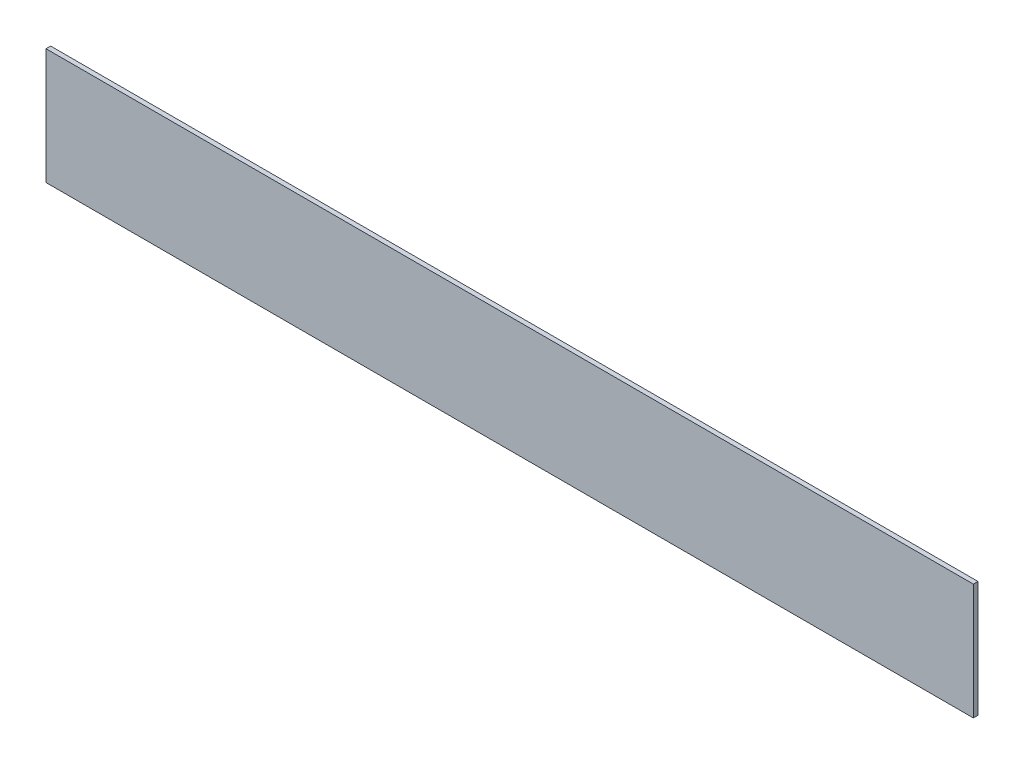
ISO-10303-21;
HEADER;
FILE_DESCRIPTION(('STEP AP214'),'2;1');
FILE_NAME('part.step','',(''),(''),'','','');
FILE_SCHEMA(('AUTOMOTIVE_DESIGN { 1 0 10303 214 1 1 1 1 }'));
ENDSEC;
DATA;
#1=APPLICATION_CONTEXT('core data for automotive mechanical design processes');
#2=APPLICATION_PROTOCOL_DEFINITION('international standard','automotive_design',2000,#1);
#3=PRODUCT_CONTEXT('',#1,'mechanical');
#4=PRODUCT('Part','Part','',(#3));
#5=PRODUCT_RELATED_PRODUCT_CATEGORY('part','',(#4));
#6=PRODUCT_DEFINITION_FORMATION('','',#4);
#7=PRODUCT_DEFINITION_CONTEXT('part definition',#1,'design');
#8=PRODUCT_DEFINITION('design','',#6,#7);
#9=PRODUCT_DEFINITION_SHAPE('','',#8);
#10=(LENGTH_UNIT() NAMED_UNIT(*) SI_UNIT(.MILLI.,.METRE.));
#11=(NAMED_UNIT(*) PLANE_ANGLE_UNIT() SI_UNIT($,.RADIAN.));
#12=(NAMED_UNIT(*) SI_UNIT($,.STERADIAN.) SOLID_ANGLE_UNIT());
#13=UNCERTAINTY_MEASURE_WITH_UNIT(LENGTH_MEASURE(1.E-05),#10,'distance_accuracy_value','');
#14=(GEOMETRIC_REPRESENTATION_CONTEXT(3) GLOBAL_UNCERTAINTY_ASSIGNED_CONTEXT((#13)) GLOBAL_UNIT_ASSIGNED_CONTEXT((#10,
#11,#12)) REPRESENTATION_CONTEXT('',''));
#15=CARTESIAN_POINT('',(0.,0.,0.));
#16=DIRECTION('',(0.,0.,1.));
#17=DIRECTION('',(1.,0.,0.));
#18=AXIS2_PLACEMENT_3D('',#15,#16,#17);
#19=CARTESIAN_POINT('',(0.,1.6,-320.));
#20=DIRECTION('',(-1.,0.,0.));
#21=DIRECTION('',(0.,0.,1.));
#22=AXIS2_PLACEMENT_3D('',#19,#20,#21);
#23=PLANE('',#22);
#24=DIRECTION('',(0.,-1.,0.));
#25=VECTOR('',#24,1.);
#26=CARTESIAN_POINT('',(0.,1.6,-318.4));
#27=LINE('',#26,#25);
#28=CARTESIAN_POINT('',(0.,41.6,-318.4));
#29=VERTEX_POINT('',#28);
#30=CARTESIAN_POINT('',(0.,1.6,-318.4));
#31=VERTEX_POINT('',#30);
#32=EDGE_CURVE('E103',#29,#31,#27,.T.);
#33=ORIENTED_EDGE('',*,*,#32,.F.);
#34=DIRECTION('',(0.,0.,1.));
#35=VECTOR('',#34,1.);
#36=CARTESIAN_POINT('',(0.,41.6,-320.));
#37=LINE('',#36,#35);
#38=CARTESIAN_POINT('',(0.,41.6,-320.));
#39=VERTEX_POINT('',#38);
#40=EDGE_CURVE('E11',#39,#29,#37,.T.);
#41=ORIENTED_EDGE('',*,*,#40,.F.);
#42=DIRECTION('',(0.,-1.,0.));
#43=VECTOR('',#42,1.);
#44=CARTESIAN_POINT('',(0.,1.6,-320.));
#45=LINE('',#44,#43);
#46=CARTESIAN_POINT('',(0.,1.6,-320.));
#47=VERTEX_POINT('',#46);
#48=EDGE_CURVE('E97',#39,#47,#45,.T.);
#49=ORIENTED_EDGE('',*,*,#48,.T.);
#50=DIRECTION('',(0.,0.,1.));
#51=VECTOR('',#50,1.);
#52=CARTESIAN_POINT('',(0.,1.6,-320.));
#53=LINE('',#52,#51);
#54=EDGE_CURVE('E42',#47,#31,#53,.T.);
#55=ORIENTED_EDGE('',*,*,#54,.T.);
#56=EDGE_LOOP('',(#33,#41,#49,#55));
#57=FACE_BOUND('',#56,.T.);
#58=ADVANCED_FACE('F39',(#57),#23,.T.);
#59=CARTESIAN_POINT('',(0.,41.6,-320.));
#60=DIRECTION('',(0.,1.,0.));
#61=DIRECTION('',(0.,0.,1.));
#62=AXIS2_PLACEMENT_3D('',#59,#60,#61);
#63=PLANE('',#62);
#64=DIRECTION('',(-1.,0.,0.));
#65=VECTOR('',#64,1.);
#66=CARTESIAN_POINT('',(0.,41.6,-318.4));
#67=LINE('',#66,#65);
#68=CARTESIAN_POINT('',(320.,41.6,-318.4));
#69=VERTEX_POINT('',#68);
#70=EDGE_CURVE('E99',#69,#29,#67,.T.);
#71=ORIENTED_EDGE('',*,*,#70,.F.);
#72=DIRECTION('',(0.,0.,1.));
#73=VECTOR('',#72,1.);
#74=CARTESIAN_POINT('',(320.,41.6,-320.));
#75=LINE('',#74,#73);
#76=CARTESIAN_POINT('',(320.,41.6,-320.));
#77=VERTEX_POINT('',#76);
#78=EDGE_CURVE('E48',#77,#69,#75,.T.);
#79=ORIENTED_EDGE('',*,*,#78,.F.);
#80=DIRECTION('',(-1.,0.,0.));
#81=VECTOR('',#80,1.);
#82=CARTESIAN_POINT('',(0.,41.6,-320.));
#83=LINE('',#82,#81);
#84=EDGE_CURVE('E94',#77,#39,#83,.T.);
#85=ORIENTED_EDGE('',*,*,#84,.T.);
#86=ORIENTED_EDGE('',*,*,#40,.T.);
#87=EDGE_LOOP('',(#71,#79,#85,#86));
#88=FACE_BOUND('',#87,.T.);
#89=ADVANCED_FACE('F113',(#88),#63,.T.);
#90=CARTESIAN_POINT('',(320.,1.6,-320.));
#91=DIRECTION('',(1.,0.,0.));
#92=DIRECTION('',(0.,0.,-1.));
#93=AXIS2_PLACEMENT_3D('',#90,#91,#92);
#94=PLANE('',#93);
#95=DIRECTION('',(0.,1.,0.));
#96=VECTOR('',#95,1.);
#97=CARTESIAN_POINT('',(320.,1.6,-318.4));
#98=LINE('',#97,#96);
#99=CARTESIAN_POINT('',(320.,1.6,-318.4));
#100=VERTEX_POINT('',#99);
#101=EDGE_CURVE('E89',#100,#69,#98,.T.);
#102=ORIENTED_EDGE('',*,*,#101,.F.);
#103=DIRECTION('',(0.,0.,1.));
#104=VECTOR('',#103,1.);
#105=CARTESIAN_POINT('',(320.,1.6,-320.));
#106=LINE('',#105,#104);
#107=CARTESIAN_POINT('',(320.,1.6,-320.));
#108=VERTEX_POINT('',#107);
#109=EDGE_CURVE('E84',#108,#100,#106,.T.);
#110=ORIENTED_EDGE('',*,*,#109,.F.);
#111=DIRECTION('',(0.,1.,0.));
#112=VECTOR('',#111,1.);
#113=CARTESIAN_POINT('',(320.,1.6,-320.));
#114=LINE('',#113,#112);
#115=EDGE_CURVE('E87',#108,#77,#114,.T.);
#116=ORIENTED_EDGE('',*,*,#115,.T.);
#117=ORIENTED_EDGE('',*,*,#78,.T.);
#118=EDGE_LOOP('',(#102,#110,#116,#117));
#119=FACE_BOUND('',#118,.T.);
#120=ADVANCED_FACE('F86',(#119),#94,.T.);
#121=CARTESIAN_POINT('',(0.,1.6,-320.));
#122=DIRECTION('',(0.,-1.,0.));
#123=DIRECTION('',(0.,0.,-1.));
#124=AXIS2_PLACEMENT_3D('',#121,#122,#123);
#125=PLANE('',#124);
#126=DIRECTION('',(1.,0.,0.));
#127=VECTOR('',#126,1.);
#128=CARTESIAN_POINT('',(0.,1.6,-318.4));
#129=LINE('',#128,#127);
#130=EDGE_CURVE('E106',#31,#100,#129,.T.);
#131=ORIENTED_EDGE('',*,*,#130,.F.);
#132=ORIENTED_EDGE('',*,*,#54,.F.);
#133=DIRECTION('',(1.,0.,0.));
#134=VECTOR('',#133,1.);
#135=CARTESIAN_POINT('',(0.,1.6,-320.));
#136=LINE('',#135,#134);
#137=EDGE_CURVE('E93',#47,#108,#136,.T.);
#138=ORIENTED_EDGE('',*,*,#137,.T.);
#139=ORIENTED_EDGE('',*,*,#109,.T.);
#140=EDGE_LOOP('',(#131,#132,#138,#139));
#141=FACE_BOUND('',#140,.T.);
#142=ADVANCED_FACE('F96',(#141),#125,.T.);
#143=CARTESIAN_POINT('',(0.,0.,-320.));
#144=DIRECTION('',(0.,0.,-1.));
#145=DIRECTION('',(-1.,0.,0.));
#146=AXIS2_PLACEMENT_3D('',#143,#144,#145);
#147=PLANE('',#146);
#148=ORIENTED_EDGE('',*,*,#48,.F.);
#149=ORIENTED_EDGE('',*,*,#84,.F.);
#150=ORIENTED_EDGE('',*,*,#115,.F.);
#151=ORIENTED_EDGE('',*,*,#137,.F.);
#152=EDGE_LOOP('',(#148,#149,#150,#151));
#153=FACE_BOUND('',#152,.T.);
#154=ADVANCED_FACE('F92',(#153),#147,.T.);
#155=CARTESIAN_POINT('',(0.,0.,-318.4));
#156=DIRECTION('',(0.,0.,-1.));
#157=DIRECTION('',(-1.,0.,0.));
#158=AXIS2_PLACEMENT_3D('',#155,#156,#157);
#159=PLANE('',#158);
#160=ORIENTED_EDGE('',*,*,#32,.T.);
#161=ORIENTED_EDGE('',*,*,#130,.T.);
#162=ORIENTED_EDGE('',*,*,#101,.T.);
#163=ORIENTED_EDGE('',*,*,#70,.T.);
#164=EDGE_LOOP('',(#160,#161,#162,#163));
#165=FACE_BOUND('',#164,.T.);
#166=ADVANCED_FACE('F112',(#165),#159,.F.);
#167=CLOSED_SHELL('',(#58,#89,#120,#142,#154,#166));
#168=MANIFOLD_SOLID_BREP('B2',#167);
#169=ADVANCED_BREP_SHAPE_REPRESENTATION('',(#18,#168),#14);
#170=SHAPE_DEFINITION_REPRESENTATION(#9,#169);
ENDSEC;
END-ISO-10303-21;
